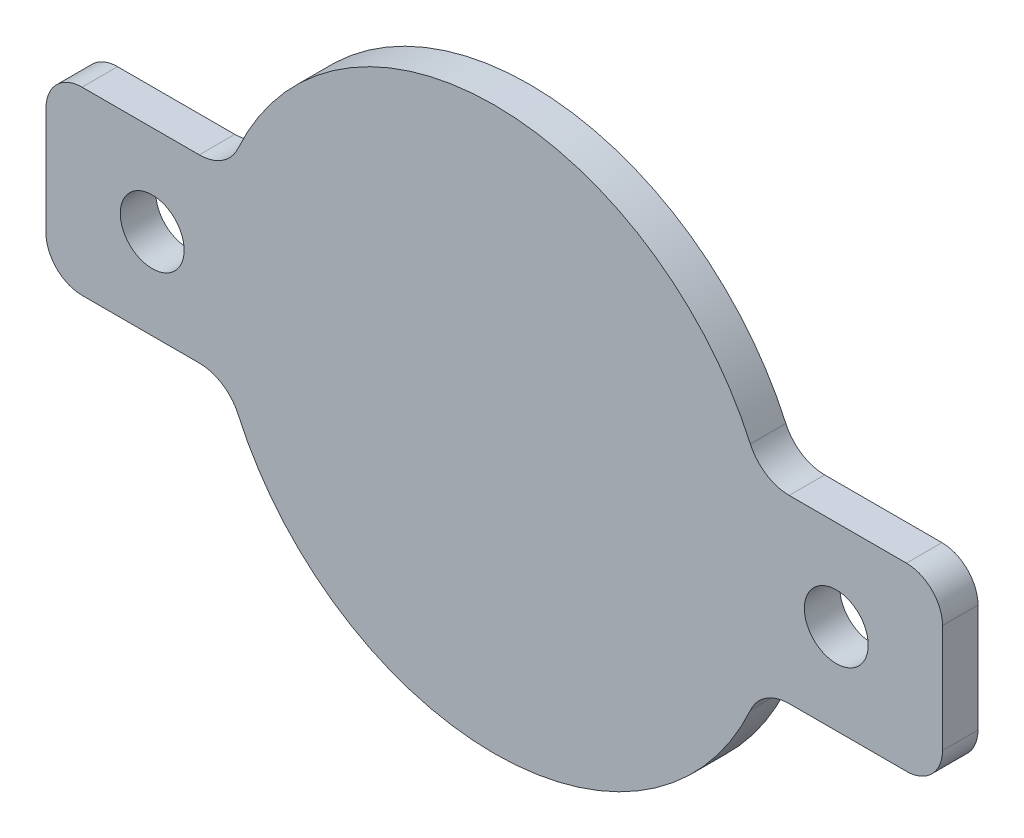
ISO-10303-21;
HEADER;
FILE_DESCRIPTION(('STEP AP214'),'2;1');
FILE_NAME('part.step','',(''),(''),'','','');
FILE_SCHEMA(('AUTOMOTIVE_DESIGN { 1 0 10303 214 1 1 1 1 }'));
ENDSEC;
DATA;
#1=APPLICATION_CONTEXT('core data for automotive mechanical design processes');
#2=APPLICATION_PROTOCOL_DEFINITION('international standard','automotive_design',2000,#1);
#3=PRODUCT_CONTEXT('',#1,'mechanical');
#4=PRODUCT('Part','Part','',(#3));
#5=PRODUCT_RELATED_PRODUCT_CATEGORY('part','',(#4));
#6=PRODUCT_DEFINITION_FORMATION('','',#4);
#7=PRODUCT_DEFINITION_CONTEXT('part definition',#1,'design');
#8=PRODUCT_DEFINITION('design','',#6,#7);
#9=PRODUCT_DEFINITION_SHAPE('','',#8);
#10=(LENGTH_UNIT() NAMED_UNIT(*) SI_UNIT(.MILLI.,.METRE.));
#11=(NAMED_UNIT(*) PLANE_ANGLE_UNIT() SI_UNIT($,.RADIAN.));
#12=(NAMED_UNIT(*) SI_UNIT($,.STERADIAN.) SOLID_ANGLE_UNIT());
#13=UNCERTAINTY_MEASURE_WITH_UNIT(LENGTH_MEASURE(1.E-05),#10,'distance_accuracy_value','');
#14=(GEOMETRIC_REPRESENTATION_CONTEXT(3) GLOBAL_UNCERTAINTY_ASSIGNED_CONTEXT((#13)) GLOBAL_UNIT_ASSIGNED_CONTEXT((#10,
#11,#12)) REPRESENTATION_CONTEXT('',''));
#15=CARTESIAN_POINT('',(0.,0.,0.));
#16=DIRECTION('',(0.,0.,1.));
#17=DIRECTION('',(1.,0.,0.));
#18=AXIS2_PLACEMENT_3D('',#15,#16,#17);
#19=CARTESIAN_POINT('',(0.,-4.16044060681201,2.5));
#20=DIRECTION('',(0.,-1.,0.));
#21=DIRECTION('',(0.,0.,-1.));
#22=AXIS2_PLACEMENT_3D('',#19,#20,#21);
#23=PLANE('',#22);
#24=DIRECTION('',(-1.,0.,0.));
#25=VECTOR('',#24,1.);
#26=CARTESIAN_POINT('',(0.,-4.16044060681201,0.));
#27=LINE('',#26,#25);
#28=CARTESIAN_POINT('',(-21.2872658744008,-4.16044060681201,0.));
#29=VERTEX_POINT('',#28);
#30=CARTESIAN_POINT('',(-29.5430388201736,-4.16044060681201,0.));
#31=VERTEX_POINT('',#30);
#32=EDGE_CURVE('E157',#29,#31,#27,.T.);
#33=ORIENTED_EDGE('',*,*,#32,.F.);
#34=DIRECTION('',(0.,0.,-1.));
#35=VECTOR('',#34,1.);
#36=CARTESIAN_POINT('',(-21.2872658744008,-4.16044060681201,2.5));
#37=LINE('',#36,#35);
#38=CARTESIAN_POINT('',(-21.2872658744008,-4.16044060681201,2.5));
#39=VERTEX_POINT('',#38);
#40=EDGE_CURVE('E242',#29,#39,#37,.F.);
#41=ORIENTED_EDGE('',*,*,#40,.T.);
#42=DIRECTION('',(-1.,0.,0.));
#43=VECTOR('',#42,1.);
#44=CARTESIAN_POINT('',(0.,-4.16044060681201,2.5));
#45=LINE('',#44,#43);
#46=CARTESIAN_POINT('',(-29.5430388201736,-4.16044060681201,2.5));
#47=VERTEX_POINT('',#46);
#48=EDGE_CURVE('E186',#39,#47,#45,.T.);
#49=ORIENTED_EDGE('',*,*,#48,.T.);
#50=DIRECTION('',(0.,0.,-1.));
#51=VECTOR('',#50,1.);
#52=CARTESIAN_POINT('',(-29.5430388201736,-4.16044060681201,2.5));
#53=LINE('',#52,#51);
#54=EDGE_CURVE('E180',#47,#31,#53,.T.);
#55=ORIENTED_EDGE('',*,*,#54,.T.);
#56=EDGE_LOOP('',(#33,#41,#49,#55));
#57=FACE_BOUND('',#56,.T.);
#58=ADVANCED_FACE('F45',(#57),#23,.T.);
#59=CARTESIAN_POINT('',(0.,-4.16044060681201,2.5));
#60=DIRECTION('',(0.,1.,0.));
#61=DIRECTION('',(0.,0.,1.));
#62=AXIS2_PLACEMENT_3D('',#59,#60,#61);
#63=PLANE('',#62);
#64=DIRECTION('',(1.,0.,0.));
#65=VECTOR('',#64,1.);
#66=CARTESIAN_POINT('',(0.,-4.16044060681201,2.5));
#67=LINE('',#66,#65);
#68=CARTESIAN_POINT('',(20.2581743086084,-4.16044060681201,2.5));
#69=VERTEX_POINT('',#68);
#70=CARTESIAN_POINT('',(28.5139472543812,-4.16044060681201,2.5));
#71=VERTEX_POINT('',#70);
#72=EDGE_CURVE('E334',#69,#71,#67,.T.);
#73=ORIENTED_EDGE('',*,*,#72,.F.);
#74=DIRECTION('',(0.,0.,1.));
#75=VECTOR('',#74,1.);
#76=CARTESIAN_POINT('',(20.2581743086084,-4.16044060681201,2.5));
#77=LINE('',#76,#75);
#78=CARTESIAN_POINT('',(20.2581743086084,-4.16044060681201,0.));
#79=VERTEX_POINT('',#78);
#80=EDGE_CURVE('E232',#69,#79,#77,.F.);
#81=ORIENTED_EDGE('',*,*,#80,.T.);
#82=DIRECTION('',(1.,0.,0.));
#83=VECTOR('',#82,1.);
#84=CARTESIAN_POINT('',(0.,-4.16044060681201,0.));
#85=LINE('',#84,#83);
#86=CARTESIAN_POINT('',(28.5139472543812,-4.16044060681201,0.));
#87=VERTEX_POINT('',#86);
#88=EDGE_CURVE('E172',#79,#87,#85,.T.);
#89=ORIENTED_EDGE('',*,*,#88,.T.);
#90=DIRECTION('',(0.,0.,-1.));
#91=VECTOR('',#90,1.);
#92=CARTESIAN_POINT('',(28.5139472543812,-4.16044060681201,2.5));
#93=LINE('',#92,#91);
#94=EDGE_CURVE('E224',#87,#71,#93,.F.);
#95=ORIENTED_EDGE('',*,*,#94,.T.);
#96=EDGE_LOOP('',(#73,#81,#89,#95));
#97=FACE_BOUND('',#96,.T.);
#98=ADVANCED_FACE('F280',(#97),#63,.F.);
#99=CARTESIAN_POINT('',(31.0539472543812,0.,2.5));
#100=DIRECTION('',(-1.,0.,0.));
#101=DIRECTION('',(0.,0.,1.));
#102=AXIS2_PLACEMENT_3D('',#99,#100,#101);
#103=PLANE('',#102);
#104=DIRECTION('',(0.,1.,0.));
#105=VECTOR('',#104,1.);
#106=CARTESIAN_POINT('',(31.0539472543812,0.,0.));
#107=LINE('',#106,#105);
#108=CARTESIAN_POINT('',(31.0539472543812,-1.62044060681201,0.));
#109=VERTEX_POINT('',#108);
#110=CARTESIAN_POINT('',(31.0539472543812,5.99955939318799,0.));
#111=VERTEX_POINT('',#110);
#112=EDGE_CURVE('E344',#109,#111,#107,.T.);
#113=ORIENTED_EDGE('',*,*,#112,.T.);
#114=DIRECTION('',(0.,0.,-1.));
#115=VECTOR('',#114,1.);
#116=CARTESIAN_POINT('',(31.0539472543812,5.99955939318799,2.5));
#117=LINE('',#116,#115);
#118=CARTESIAN_POINT('',(31.0539472543812,5.99955939318799,2.5));
#119=VERTEX_POINT('',#118);
#120=EDGE_CURVE('E222',#111,#119,#117,.F.);
#121=ORIENTED_EDGE('',*,*,#120,.T.);
#122=DIRECTION('',(0.,1.,0.));
#123=VECTOR('',#122,1.);
#124=CARTESIAN_POINT('',(31.0539472543812,0.,2.5));
#125=LINE('',#124,#123);
#126=CARTESIAN_POINT('',(31.0539472543812,-1.62044060681201,2.5));
#127=VERTEX_POINT('',#126);
#128=EDGE_CURVE('E336',#127,#119,#125,.T.);
#129=ORIENTED_EDGE('',*,*,#128,.F.);
#130=DIRECTION('',(0.,0.,-1.));
#131=VECTOR('',#130,1.);
#132=CARTESIAN_POINT('',(31.0539472543812,-1.62044060681201,2.5));
#133=LINE('',#132,#131);
#134=EDGE_CURVE('E219',#127,#109,#133,.T.);
#135=ORIENTED_EDGE('',*,*,#134,.T.);
#136=EDGE_LOOP('',(#113,#121,#129,#135));
#137=FACE_BOUND('',#136,.T.);
#138=ADVANCED_FACE('F286',(#137),#103,.F.);
#139=CARTESIAN_POINT('',(0.,8.53955939318799,2.5));
#140=DIRECTION('',(0.,-1.,0.));
#141=DIRECTION('',(0.,0.,-1.));
#142=AXIS2_PLACEMENT_3D('',#139,#140,#141);
#143=PLANE('',#142);
#144=DIRECTION('',(-1.,0.,0.));
#145=VECTOR('',#144,1.);
#146=CARTESIAN_POINT('',(0.,8.53955939318799,0.));
#147=LINE('',#146,#145);
#148=CARTESIAN_POINT('',(28.5139472543812,8.53955939318799,0.));
#149=VERTEX_POINT('',#148);
#150=CARTESIAN_POINT('',(20.2581743086084,8.53955939318799,0.));
#151=VERTEX_POINT('',#150);
#152=EDGE_CURVE('E347',#149,#151,#147,.T.);
#153=ORIENTED_EDGE('',*,*,#152,.T.);
#154=DIRECTION('',(0.,0.,1.));
#155=VECTOR('',#154,1.);
#156=CARTESIAN_POINT('',(20.2581743086084,8.53955939318799,2.5));
#157=LINE('',#156,#155);
#158=CARTESIAN_POINT('',(20.2581743086084,8.53955939318799,2.5));
#159=VERTEX_POINT('',#158);
#160=EDGE_CURVE('E234',#151,#159,#157,.T.);
#161=ORIENTED_EDGE('',*,*,#160,.T.);
#162=DIRECTION('',(-1.,0.,0.));
#163=VECTOR('',#162,1.);
#164=CARTESIAN_POINT('',(0.,8.53955939318799,2.5));
#165=LINE('',#164,#163);
#166=CARTESIAN_POINT('',(28.5139472543812,8.53955939318799,2.5));
#167=VERTEX_POINT('',#166);
#168=EDGE_CURVE('E339',#167,#159,#165,.T.);
#169=ORIENTED_EDGE('',*,*,#168,.F.);
#170=DIRECTION('',(0.,0.,-1.));
#171=VECTOR('',#170,1.);
#172=CARTESIAN_POINT('',(28.5139472543812,8.53955939318799,2.5));
#173=LINE('',#172,#171);
#174=EDGE_CURVE('E216',#167,#149,#173,.T.);
#175=ORIENTED_EDGE('',*,*,#174,.T.);
#176=EDGE_LOOP('',(#153,#161,#169,#175));
#177=FACE_BOUND('',#176,.T.);
#178=ADVANCED_FACE('F367',(#177),#143,.F.);
#179=CARTESIAN_POINT('',(0.,8.53955939318799,2.5));
#180=DIRECTION('',(0.,1.,0.));
#181=DIRECTION('',(0.,0.,1.));
#182=AXIS2_PLACEMENT_3D('',#179,#180,#181);
#183=PLANE('',#182);
#184=DIRECTION('',(1.,0.,0.));
#185=VECTOR('',#184,1.);
#186=CARTESIAN_POINT('',(0.,8.53955939318799,2.5));
#187=LINE('',#186,#185);
#188=CARTESIAN_POINT('',(-29.5430388201736,8.53955939318799,2.5));
#189=VERTEX_POINT('',#188);
#190=CARTESIAN_POINT('',(-21.2872658744008,8.53955939318799,2.5));
#191=VERTEX_POINT('',#190);
#192=EDGE_CURVE('E195',#189,#191,#187,.T.);
#193=ORIENTED_EDGE('',*,*,#192,.T.);
#194=DIRECTION('',(0.,0.,-1.));
#195=VECTOR('',#194,1.);
#196=CARTESIAN_POINT('',(-21.2872658744008,8.53955939318799,0.));
#197=LINE('',#196,#195);
#198=CARTESIAN_POINT('',(-21.2872658744008,8.53955939318799,0.));
#199=VERTEX_POINT('',#198);
#200=EDGE_CURVE('E66',#191,#199,#197,.T.);
#201=ORIENTED_EDGE('',*,*,#200,.T.);
#202=DIRECTION('',(1.,0.,0.));
#203=VECTOR('',#202,1.);
#204=CARTESIAN_POINT('',(0.,8.53955939318799,0.));
#205=LINE('',#204,#203);
#206=CARTESIAN_POINT('',(-29.5430388201736,8.53955939318799,0.));
#207=VERTEX_POINT('',#206);
#208=EDGE_CURVE('E349',#207,#199,#205,.T.);
#209=ORIENTED_EDGE('',*,*,#208,.F.);
#210=DIRECTION('',(0.,0.,-1.));
#211=VECTOR('',#210,1.);
#212=CARTESIAN_POINT('',(-29.5430388201736,8.53955939318799,2.5));
#213=LINE('',#212,#211);
#214=EDGE_CURVE('E214',#207,#189,#213,.F.);
#215=ORIENTED_EDGE('',*,*,#214,.T.);
#216=EDGE_LOOP('',(#193,#201,#209,#215));
#217=FACE_BOUND('',#216,.T.);
#218=ADVANCED_FACE('F357',(#217),#183,.T.);
#219=CARTESIAN_POINT('',(-32.0830388201736,0.,2.5));
#220=DIRECTION('',(-1.,0.,0.));
#221=DIRECTION('',(0.,0.,1.));
#222=AXIS2_PLACEMENT_3D('',#219,#220,#221);
#223=PLANE('',#222);
#224=DIRECTION('',(0.,1.,0.));
#225=VECTOR('',#224,1.);
#226=CARTESIAN_POINT('',(-32.0830388201736,0.,0.));
#227=LINE('',#226,#225);
#228=CARTESIAN_POINT('',(-32.0830388201736,-1.62044060681201,0.));
#229=VERTEX_POINT('',#228);
#230=CARTESIAN_POINT('',(-32.0830388201736,5.99955939318799,0.));
#231=VERTEX_POINT('',#230);
#232=EDGE_CURVE('E198',#229,#231,#227,.T.);
#233=ORIENTED_EDGE('',*,*,#232,.F.);
#234=DIRECTION('',(0.,0.,-1.));
#235=VECTOR('',#234,1.);
#236=CARTESIAN_POINT('',(-32.0830388201736,-1.62044060681201,2.5));
#237=LINE('',#236,#235);
#238=CARTESIAN_POINT('',(-32.0830388201736,-1.62044060681201,2.5));
#239=VERTEX_POINT('',#238);
#240=EDGE_CURVE('E181',#229,#239,#237,.F.);
#241=ORIENTED_EDGE('',*,*,#240,.T.);
#242=DIRECTION('',(0.,1.,0.));
#243=VECTOR('',#242,1.);
#244=CARTESIAN_POINT('',(-32.0830388201736,0.,2.5));
#245=LINE('',#244,#243);
#246=CARTESIAN_POINT('',(-32.0830388201736,5.99955939318799,2.5));
#247=VERTEX_POINT('',#246);
#248=EDGE_CURVE('E189',#239,#247,#245,.T.);
#249=ORIENTED_EDGE('',*,*,#248,.T.);
#250=DIRECTION('',(0.,0.,-1.));
#251=VECTOR('',#250,1.);
#252=CARTESIAN_POINT('',(-32.0830388201736,5.99955939318799,2.5));
#253=LINE('',#252,#251);
#254=EDGE_CURVE('E182',#247,#231,#253,.T.);
#255=ORIENTED_EDGE('',*,*,#254,.T.);
#256=EDGE_LOOP('',(#233,#241,#249,#255));
#257=FACE_BOUND('',#256,.T.);
#258=ADVANCED_FACE('F352',(#257),#223,.T.);
#259=CARTESIAN_POINT('',(0.,0.,2.5));
#260=DIRECTION('',(0.,0.,1.));
#261=DIRECTION('',(1.,0.,0.));
#262=AXIS2_PLACEMENT_3D('',#259,#260,#261);
#263=PLANE('',#262);
#264=ORIENTED_EDGE('',*,*,#48,.F.);
#265=CARTESIAN_POINT('',(-21.2872658744008,-7.16044060681201,2.5));
#266=DIRECTION('',(0.,0.,1.));
#267=DIRECTION('',(1.,0.,0.));
#268=AXIS2_PLACEMENT_3D('',#265,#266,#267);
#269=CIRCLE('',#268,3.);
#270=CARTESIAN_POINT('',(-18.5516135357479,-5.92909732322992,2.5));
#271=VERTEX_POINT('',#270);
#272=EDGE_CURVE('E253',#39,#271,#269,.F.);
#273=ORIENTED_EDGE('',*,*,#272,.T.);
#274=CARTESIAN_POINT('',(-0.514545782896191,2.18955939318799,2.5));
#275=DIRECTION('',(0.,0.,1.));
#276=DIRECTION('',(1.,0.,0.));
#277=AXIS2_PLACEMENT_3D('',#274,#275,#276);
#278=CIRCLE('',#277,19.78);
#279=CARTESIAN_POINT('',(17.5225219699555,-5.92909732322992,2.5));
#280=VERTEX_POINT('',#279);
#281=EDGE_CURVE('E259',#271,#280,#278,.T.);
#282=ORIENTED_EDGE('',*,*,#281,.T.);
#283=CARTESIAN_POINT('',(20.2581743086084,-7.16044060681201,2.5));
#284=DIRECTION('',(0.,0.,1.));
#285=DIRECTION('',(1.,0.,0.));
#286=AXIS2_PLACEMENT_3D('',#283,#284,#285);
#287=CIRCLE('',#286,3.);
#288=EDGE_CURVE('E245',#280,#69,#287,.F.);
#289=ORIENTED_EDGE('',*,*,#288,.T.);
#290=ORIENTED_EDGE('',*,*,#72,.T.);
#291=CARTESIAN_POINT('',(28.5139472543812,-1.62044060681201,2.5));
#292=DIRECTION('',(0.,0.,1.));
#293=DIRECTION('',(1.,0.,0.));
#294=AXIS2_PLACEMENT_3D('',#291,#292,#293);
#295=CIRCLE('',#294,2.54);
#296=EDGE_CURVE('E206',#71,#127,#295,.T.);
#297=ORIENTED_EDGE('',*,*,#296,.T.);
#298=ORIENTED_EDGE('',*,*,#128,.T.);
#299=CARTESIAN_POINT('',(28.5139472543812,5.99955939318799,2.5));
#300=DIRECTION('',(0.,0.,1.));
#301=DIRECTION('',(1.,0.,0.));
#302=AXIS2_PLACEMENT_3D('',#299,#300,#301);
#303=CIRCLE('',#302,2.54);
#304=EDGE_CURVE('E208',#119,#167,#303,.T.);
#305=ORIENTED_EDGE('',*,*,#304,.T.);
#306=ORIENTED_EDGE('',*,*,#168,.T.);
#307=CARTESIAN_POINT('',(20.2581743086084,11.539559393188,2.5));
#308=DIRECTION('',(0.,0.,1.));
#309=DIRECTION('',(1.,0.,0.));
#310=AXIS2_PLACEMENT_3D('',#307,#308,#309);
#311=CIRCLE('',#310,3.);
#312=CARTESIAN_POINT('',(17.5225219699555,10.3082161096059,2.5));
#313=VERTEX_POINT('',#312);
#314=EDGE_CURVE('E249',#159,#313,#311,.F.);
#315=ORIENTED_EDGE('',*,*,#314,.T.);
#316=CARTESIAN_POINT('',(-0.514545782896191,2.18955939318799,2.5));
#317=DIRECTION('',(0.,0.,1.));
#318=DIRECTION('',(1.,0.,0.));
#319=AXIS2_PLACEMENT_3D('',#316,#317,#318);
#320=CIRCLE('',#319,19.78);
#321=CARTESIAN_POINT('',(-18.5516135357479,10.3082161096059,2.5));
#322=VERTEX_POINT('',#321);
#323=EDGE_CURVE('E315',#313,#322,#320,.T.);
#324=ORIENTED_EDGE('',*,*,#323,.T.);
#325=CARTESIAN_POINT('',(-21.2872658744008,11.539559393188,2.5));
#326=DIRECTION('',(0.,0.,1.));
#327=DIRECTION('',(1.,0.,0.));
#328=AXIS2_PLACEMENT_3D('',#325,#326,#327);
#329=CIRCLE('',#328,3.);
#330=EDGE_CURVE('E53',#322,#191,#329,.F.);
#331=ORIENTED_EDGE('',*,*,#330,.T.);
#332=ORIENTED_EDGE('',*,*,#192,.F.);
#333=CARTESIAN_POINT('',(-29.5430388201736,5.99955939318799,2.5));
#334=DIRECTION('',(0.,0.,1.));
#335=DIRECTION('',(1.,0.,0.));
#336=AXIS2_PLACEMENT_3D('',#333,#334,#335);
#337=CIRCLE('',#336,2.54);
#338=EDGE_CURVE('E210',#189,#247,#337,.T.);
#339=ORIENTED_EDGE('',*,*,#338,.T.);
#340=ORIENTED_EDGE('',*,*,#248,.F.);
#341=CARTESIAN_POINT('',(-29.5430388201736,-1.62044060681201,2.5));
#342=DIRECTION('',(0.,0.,1.));
#343=DIRECTION('',(1.,0.,0.));
#344=AXIS2_PLACEMENT_3D('',#341,#342,#343);
#345=CIRCLE('',#344,2.54);
#346=EDGE_CURVE('E212',#239,#47,#345,.T.);
#347=ORIENTED_EDGE('',*,*,#346,.T.);
#348=EDGE_LOOP('',(#264,#273,#282,#289,#290,#297,#298,#305,#306,#315,#324,#331,#332,#339,#340,#347));
#349=FACE_BOUND('',#348,.T.);
#350=CARTESIAN_POINT('',(-24.6024947889799,2.18955939318799,2.5));
#351=DIRECTION('',(0.,0.,1.));
#352=DIRECTION('',(1.,0.,0.));
#353=AXIS2_PLACEMENT_3D('',#350,#351,#352);
#354=CIRCLE('',#353,2.24999999999999);
#355=CARTESIAN_POINT('',(-22.3524947889799,2.18955939318799,2.5));
#356=VERTEX_POINT('',#355);
#357=EDGE_CURVE('E321',#356,#356,#354,.T.);
#358=ORIENTED_EDGE('',*,*,#357,.F.);
#359=EDGE_LOOP('',(#358));
#360=FACE_BOUND('',#359,.T.);
#361=CARTESIAN_POINT('',(23.5734032231875,2.18955939318799,2.5));
#362=DIRECTION('',(0.,0.,1.));
#363=DIRECTION('',(1.,0.,0.));
#364=AXIS2_PLACEMENT_3D('',#361,#362,#363);
#365=CIRCLE('',#364,2.24999999999999);
#366=CARTESIAN_POINT('',(25.8234032231875,2.18955939318799,2.5));
#367=VERTEX_POINT('',#366);
#368=EDGE_CURVE('E328',#367,#367,#365,.T.);
#369=ORIENTED_EDGE('',*,*,#368,.F.);
#370=EDGE_LOOP('',(#369));
#371=FACE_BOUND('',#370,.T.);
#372=ADVANCED_FACE('F257',(#349,#360,#371),#263,.T.);
#373=CARTESIAN_POINT('',(0.,0.,0.));
#374=DIRECTION('',(0.,0.,1.));
#375=DIRECTION('',(1.,0.,0.));
#376=AXIS2_PLACEMENT_3D('',#373,#374,#375);
#377=PLANE('',#376);
#378=ORIENTED_EDGE('',*,*,#88,.F.);
#379=CARTESIAN_POINT('',(20.2581743086084,-7.16044060681201,0.));
#380=DIRECTION('',(0.,0.,1.));
#381=DIRECTION('',(1.,0.,0.));
#382=AXIS2_PLACEMENT_3D('',#379,#380,#381);
#383=CIRCLE('',#382,3.);
#384=CARTESIAN_POINT('',(17.5225219699555,-5.92909732322992,0.));
#385=VERTEX_POINT('',#384);
#386=EDGE_CURVE('E247',#79,#385,#383,.T.);
#387=ORIENTED_EDGE('',*,*,#386,.T.);
#388=CARTESIAN_POINT('',(-0.514545782896191,2.18955939318799,0.));
#389=DIRECTION('',(0.,0.,1.));
#390=DIRECTION('',(1.,0.,0.));
#391=AXIS2_PLACEMENT_3D('',#388,#389,#390);
#392=CIRCLE('',#391,19.78);
#393=CARTESIAN_POINT('',(-18.5516135357479,-5.92909732322992,0.));
#394=VERTEX_POINT('',#393);
#395=EDGE_CURVE('E266',#394,#385,#392,.T.);
#396=ORIENTED_EDGE('',*,*,#395,.F.);
#397=CARTESIAN_POINT('',(-21.2872658744008,-7.16044060681201,0.));
#398=DIRECTION('',(0.,0.,1.));
#399=DIRECTION('',(1.,0.,0.));
#400=AXIS2_PLACEMENT_3D('',#397,#398,#399);
#401=CIRCLE('',#400,3.);
#402=EDGE_CURVE('E167',#394,#29,#401,.T.);
#403=ORIENTED_EDGE('',*,*,#402,.T.);
#404=ORIENTED_EDGE('',*,*,#32,.T.);
#405=CARTESIAN_POINT('',(-29.5430388201736,-1.62044060681201,0.));
#406=DIRECTION('',(0.,0.,1.));
#407=DIRECTION('',(1.,0.,0.));
#408=AXIS2_PLACEMENT_3D('',#405,#406,#407);
#409=CIRCLE('',#408,2.54);
#410=EDGE_CURVE('E163',#31,#229,#409,.F.);
#411=ORIENTED_EDGE('',*,*,#410,.T.);
#412=ORIENTED_EDGE('',*,*,#232,.T.);
#413=CARTESIAN_POINT('',(-29.5430388201736,5.99955939318799,0.));
#414=DIRECTION('',(0.,0.,1.));
#415=DIRECTION('',(1.,0.,0.));
#416=AXIS2_PLACEMENT_3D('',#413,#414,#415);
#417=CIRCLE('',#416,2.54);
#418=EDGE_CURVE('E183',#231,#207,#417,.F.);
#419=ORIENTED_EDGE('',*,*,#418,.T.);
#420=ORIENTED_EDGE('',*,*,#208,.T.);
#421=CARTESIAN_POINT('',(-21.2872658744008,11.539559393188,0.));
#422=DIRECTION('',(0.,0.,1.));
#423=DIRECTION('',(1.,0.,0.));
#424=AXIS2_PLACEMENT_3D('',#421,#422,#423);
#425=CIRCLE('',#424,3.);
#426=CARTESIAN_POINT('',(-18.5516135357479,10.3082161096059,0.));
#427=VERTEX_POINT('',#426);
#428=EDGE_CURVE('E11',#199,#427,#425,.T.);
#429=ORIENTED_EDGE('',*,*,#428,.T.);
#430=CARTESIAN_POINT('',(-0.514545782896191,2.18955939318799,0.));
#431=DIRECTION('',(0.,0.,1.));
#432=DIRECTION('',(1.,0.,0.));
#433=AXIS2_PLACEMENT_3D('',#430,#431,#432);
#434=CIRCLE('',#433,19.78);
#435=CARTESIAN_POINT('',(17.5225219699555,10.3082161096059,0.));
#436=VERTEX_POINT('',#435);
#437=EDGE_CURVE('E317',#436,#427,#434,.T.);
#438=ORIENTED_EDGE('',*,*,#437,.F.);
#439=CARTESIAN_POINT('',(20.2581743086084,11.539559393188,0.));
#440=DIRECTION('',(0.,0.,1.));
#441=DIRECTION('',(1.,0.,0.));
#442=AXIS2_PLACEMENT_3D('',#439,#440,#441);
#443=CIRCLE('',#442,3.);
#444=EDGE_CURVE('E251',#436,#151,#443,.T.);
#445=ORIENTED_EDGE('',*,*,#444,.T.);
#446=ORIENTED_EDGE('',*,*,#152,.F.);
#447=CARTESIAN_POINT('',(28.5139472543812,5.99955939318799,0.));
#448=DIRECTION('',(0.,0.,1.));
#449=DIRECTION('',(1.,0.,0.));
#450=AXIS2_PLACEMENT_3D('',#447,#448,#449);
#451=CIRCLE('',#450,2.54);
#452=EDGE_CURVE('E192',#149,#111,#451,.F.);
#453=ORIENTED_EDGE('',*,*,#452,.T.);
#454=ORIENTED_EDGE('',*,*,#112,.F.);
#455=CARTESIAN_POINT('',(28.5139472543812,-1.62044060681201,0.));
#456=DIRECTION('',(0.,0.,1.));
#457=DIRECTION('',(1.,0.,0.));
#458=AXIS2_PLACEMENT_3D('',#455,#456,#457);
#459=CIRCLE('',#458,2.54);
#460=EDGE_CURVE('E188',#109,#87,#459,.F.);
#461=ORIENTED_EDGE('',*,*,#460,.T.);
#462=EDGE_LOOP('',(#378,#387,#396,#403,#404,#411,#412,#419,#420,#429,#438,#445,#446,#453,#454,#461));
#463=FACE_BOUND('',#462,.T.);
#464=CARTESIAN_POINT('',(-24.6024947889799,2.18955939318799,0.));
#465=DIRECTION('',(0.,0.,1.));
#466=DIRECTION('',(1.,0.,0.));
#467=AXIS2_PLACEMENT_3D('',#464,#465,#466);
#468=CIRCLE('',#467,2.25);
#469=CARTESIAN_POINT('',(-22.3524947889799,2.18955939318799,0.));
#470=VERTEX_POINT('',#469);
#471=EDGE_CURVE('E325',#470,#470,#468,.T.);
#472=ORIENTED_EDGE('',*,*,#471,.T.);
#473=EDGE_LOOP('',(#472));
#474=FACE_BOUND('',#473,.T.);
#475=CARTESIAN_POINT('',(23.5734032231875,2.18955939318799,0.));
#476=DIRECTION('',(0.,0.,1.));
#477=DIRECTION('',(1.,0.,0.));
#478=AXIS2_PLACEMENT_3D('',#475,#476,#477);
#479=CIRCLE('',#478,2.25);
#480=CARTESIAN_POINT('',(25.8234032231875,2.18955939318799,0.));
#481=VERTEX_POINT('',#480);
#482=EDGE_CURVE('E173',#481,#481,#479,.T.);
#483=ORIENTED_EDGE('',*,*,#482,.T.);
#484=EDGE_LOOP('',(#483));
#485=FACE_BOUND('',#484,.T.);
#486=ADVANCED_FACE('F160',(#463,#474,#485),#377,.F.);
#487=CARTESIAN_POINT('',(-29.5430388201736,-1.62044060681201,2.5));
#488=DIRECTION('',(0.,0.,-1.));
#489=DIRECTION('',(-1.,0.,0.));
#490=AXIS2_PLACEMENT_3D('',#487,#488,#489);
#491=CYLINDRICAL_SURFACE('',#490,2.54);
#492=ORIENTED_EDGE('',*,*,#346,.F.);
#493=ORIENTED_EDGE('',*,*,#240,.F.);
#494=ORIENTED_EDGE('',*,*,#410,.F.);
#495=ORIENTED_EDGE('',*,*,#54,.F.);
#496=EDGE_LOOP('',(#492,#493,#494,#495));
#497=FACE_BOUND('',#496,.T.);
#498=ADVANCED_FACE('F179',(#497),#491,.T.);
#499=CARTESIAN_POINT('',(-29.5430388201736,5.99955939318799,2.5));
#500=DIRECTION('',(0.,0.,-1.));
#501=DIRECTION('',(-1.,0.,0.));
#502=AXIS2_PLACEMENT_3D('',#499,#500,#501);
#503=CYLINDRICAL_SURFACE('',#502,2.54);
#504=ORIENTED_EDGE('',*,*,#338,.F.);
#505=ORIENTED_EDGE('',*,*,#214,.F.);
#506=ORIENTED_EDGE('',*,*,#418,.F.);
#507=ORIENTED_EDGE('',*,*,#254,.F.);
#508=EDGE_LOOP('',(#504,#505,#506,#507));
#509=FACE_BOUND('',#508,.T.);
#510=ADVANCED_FACE('F293',(#509),#503,.T.);
#511=CARTESIAN_POINT('',(28.5139472543812,5.99955939318799,2.5));
#512=DIRECTION('',(0.,0.,-1.));
#513=DIRECTION('',(-1.,0.,0.));
#514=AXIS2_PLACEMENT_3D('',#511,#512,#513);
#515=CYLINDRICAL_SURFACE('',#514,2.54);
#516=ORIENTED_EDGE('',*,*,#304,.F.);
#517=ORIENTED_EDGE('',*,*,#120,.F.);
#518=ORIENTED_EDGE('',*,*,#452,.F.);
#519=ORIENTED_EDGE('',*,*,#174,.F.);
#520=EDGE_LOOP('',(#516,#517,#518,#519));
#521=FACE_BOUND('',#520,.T.);
#522=ADVANCED_FACE('F296',(#521),#515,.T.);
#523=CARTESIAN_POINT('',(28.5139472543812,-1.62044060681201,2.5));
#524=DIRECTION('',(0.,0.,-1.));
#525=DIRECTION('',(-1.,0.,0.));
#526=AXIS2_PLACEMENT_3D('',#523,#524,#525);
#527=CYLINDRICAL_SURFACE('',#526,2.54);
#528=ORIENTED_EDGE('',*,*,#296,.F.);
#529=ORIENTED_EDGE('',*,*,#94,.F.);
#530=ORIENTED_EDGE('',*,*,#460,.F.);
#531=ORIENTED_EDGE('',*,*,#134,.F.);
#532=EDGE_LOOP('',(#528,#529,#530,#531));
#533=FACE_BOUND('',#532,.T.);
#534=ADVANCED_FACE('F300',(#533),#527,.T.);
#535=CARTESIAN_POINT('',(23.5734032231875,2.18955939318799,2.5));
#536=DIRECTION('',(0.,0.,1.));
#537=DIRECTION('',(1.,0.,0.));
#538=AXIS2_PLACEMENT_3D('',#535,#536,#537);
#539=CYLINDRICAL_SURFACE('',#538,2.24999999999999);
#540=ORIENTED_EDGE('',*,*,#482,.F.);
#541=EDGE_LOOP('',(#540));
#542=FACE_BOUND('',#541,.T.);
#543=ORIENTED_EDGE('',*,*,#368,.T.);
#544=EDGE_LOOP('',(#543));
#545=FACE_BOUND('',#544,.T.);
#546=ADVANCED_FACE('F304',(#542,#545),#539,.F.);
#547=CARTESIAN_POINT('',(-24.6024947889799,2.18955939318799,2.5));
#548=DIRECTION('',(0.,0.,1.));
#549=DIRECTION('',(1.,0.,0.));
#550=AXIS2_PLACEMENT_3D('',#547,#548,#549);
#551=CYLINDRICAL_SURFACE('',#550,2.24999999999999);
#552=ORIENTED_EDGE('',*,*,#471,.F.);
#553=EDGE_LOOP('',(#552));
#554=FACE_BOUND('',#553,.T.);
#555=ORIENTED_EDGE('',*,*,#357,.T.);
#556=EDGE_LOOP('',(#555));
#557=FACE_BOUND('',#556,.T.);
#558=ADVANCED_FACE('F397',(#554,#557),#551,.F.);
#559=CARTESIAN_POINT('',(-0.514545782896191,2.18955939318799,0.));
#560=DIRECTION('',(0.,0.,1.));
#561=DIRECTION('',(1.,0.,0.));
#562=AXIS2_PLACEMENT_3D('',#559,#560,#561);
#563=CYLINDRICAL_SURFACE('',#562,19.78);
#564=ORIENTED_EDGE('',*,*,#323,.F.);
#565=DIRECTION('',(0.,0.,1.));
#566=VECTOR('',#565,1.);
#567=CARTESIAN_POINT('',(17.5225219699555,10.3082161096059,0.));
#568=LINE('',#567,#566);
#569=EDGE_CURVE('E240',#313,#436,#568,.F.);
#570=ORIENTED_EDGE('',*,*,#569,.T.);
#571=ORIENTED_EDGE('',*,*,#437,.T.);
#572=DIRECTION('',(0.,0.,1.));
#573=VECTOR('',#572,1.);
#574=CARTESIAN_POINT('',(-18.5516135357479,10.3082161096059,0.));
#575=LINE('',#574,#573);
#576=EDGE_CURVE('E237',#427,#322,#575,.T.);
#577=ORIENTED_EDGE('',*,*,#576,.T.);
#578=EDGE_LOOP('',(#564,#570,#571,#577));
#579=FACE_BOUND('',#578,.T.);
#580=ADVANCED_FACE('F311',(#579),#563,.T.);
#581=CARTESIAN_POINT('',(-0.514545782896191,2.18955939318799,0.));
#582=DIRECTION('',(0.,0.,1.));
#583=DIRECTION('',(1.,0.,0.));
#584=AXIS2_PLACEMENT_3D('',#581,#582,#583);
#585=CYLINDRICAL_SURFACE('',#584,19.78);
#586=ORIENTED_EDGE('',*,*,#395,.T.);
#587=DIRECTION('',(0.,0.,1.));
#588=VECTOR('',#587,1.);
#589=CARTESIAN_POINT('',(17.5225219699555,-5.92909732322992,0.));
#590=LINE('',#589,#588);
#591=EDGE_CURVE('E229',#385,#280,#590,.T.);
#592=ORIENTED_EDGE('',*,*,#591,.T.);
#593=ORIENTED_EDGE('',*,*,#281,.F.);
#594=DIRECTION('',(0.,0.,1.));
#595=VECTOR('',#594,1.);
#596=CARTESIAN_POINT('',(-18.5516135357479,-5.92909732322992,0.));
#597=LINE('',#596,#595);
#598=EDGE_CURVE('E227',#271,#394,#597,.F.);
#599=ORIENTED_EDGE('',*,*,#598,.T.);
#600=EDGE_LOOP('',(#586,#592,#593,#599));
#601=FACE_BOUND('',#600,.T.);
#602=ADVANCED_FACE('F264',(#601),#585,.T.);
#603=CARTESIAN_POINT('',(20.2581743086084,-7.16044060681201,0.));
#604=DIRECTION('',(0.,0.,1.));
#605=DIRECTION('',(1.,0.,0.));
#606=AXIS2_PLACEMENT_3D('',#603,#604,#605);
#607=CYLINDRICAL_SURFACE('',#606,3.);
#608=ORIENTED_EDGE('',*,*,#386,.F.);
#609=ORIENTED_EDGE('',*,*,#80,.F.);
#610=ORIENTED_EDGE('',*,*,#288,.F.);
#611=ORIENTED_EDGE('',*,*,#591,.F.);
#612=EDGE_LOOP('',(#608,#609,#610,#611));
#613=FACE_BOUND('',#612,.T.);
#614=ADVANCED_FACE('F276',(#613),#607,.F.);
#615=CARTESIAN_POINT('',(20.2581743086084,11.539559393188,0.));
#616=DIRECTION('',(0.,0.,1.));
#617=DIRECTION('',(1.,0.,0.));
#618=AXIS2_PLACEMENT_3D('',#615,#616,#617);
#619=CYLINDRICAL_SURFACE('',#618,3.);
#620=ORIENTED_EDGE('',*,*,#444,.F.);
#621=ORIENTED_EDGE('',*,*,#569,.F.);
#622=ORIENTED_EDGE('',*,*,#314,.F.);
#623=ORIENTED_EDGE('',*,*,#160,.F.);
#624=EDGE_LOOP('',(#620,#621,#622,#623));
#625=FACE_BOUND('',#624,.T.);
#626=ADVANCED_FACE('F270',(#625),#619,.F.);
#627=CARTESIAN_POINT('',(-21.2872658744008,-7.16044060681201,0.));
#628=DIRECTION('',(0.,0.,1.));
#629=DIRECTION('',(1.,0.,0.));
#630=AXIS2_PLACEMENT_3D('',#627,#628,#629);
#631=CYLINDRICAL_SURFACE('',#630,3.);
#632=ORIENTED_EDGE('',*,*,#402,.F.);
#633=ORIENTED_EDGE('',*,*,#598,.F.);
#634=ORIENTED_EDGE('',*,*,#272,.F.);
#635=ORIENTED_EDGE('',*,*,#40,.F.);
#636=EDGE_LOOP('',(#632,#633,#634,#635));
#637=FACE_BOUND('',#636,.T.);
#638=ADVANCED_FACE('F268',(#637),#631,.F.);
#639=CARTESIAN_POINT('',(-21.2872658744008,11.539559393188,0.));
#640=DIRECTION('',(0.,0.,1.));
#641=DIRECTION('',(1.,0.,0.));
#642=AXIS2_PLACEMENT_3D('',#639,#640,#641);
#643=CYLINDRICAL_SURFACE('',#642,3.);
#644=ORIENTED_EDGE('',*,*,#428,.F.);
#645=ORIENTED_EDGE('',*,*,#200,.F.);
#646=ORIENTED_EDGE('',*,*,#330,.F.);
#647=ORIENTED_EDGE('',*,*,#576,.F.);
#648=EDGE_LOOP('',(#644,#645,#646,#647));
#649=FACE_BOUND('',#648,.T.);
#650=ADVANCED_FACE('F47',(#649),#643,.F.);
#651=CLOSED_SHELL('',(#58,#98,#138,#178,#218,#258,#372,#486,#498,#510,#522,#534,#546,#558,#580,
#602,#614,#626,#638,#650));
#652=MANIFOLD_SOLID_BREP('B2',#651);
#653=ADVANCED_BREP_SHAPE_REPRESENTATION('',(#18,#652),#14);
#654=SHAPE_DEFINITION_REPRESENTATION(#9,#653);
ENDSEC;
END-ISO-10303-21;
